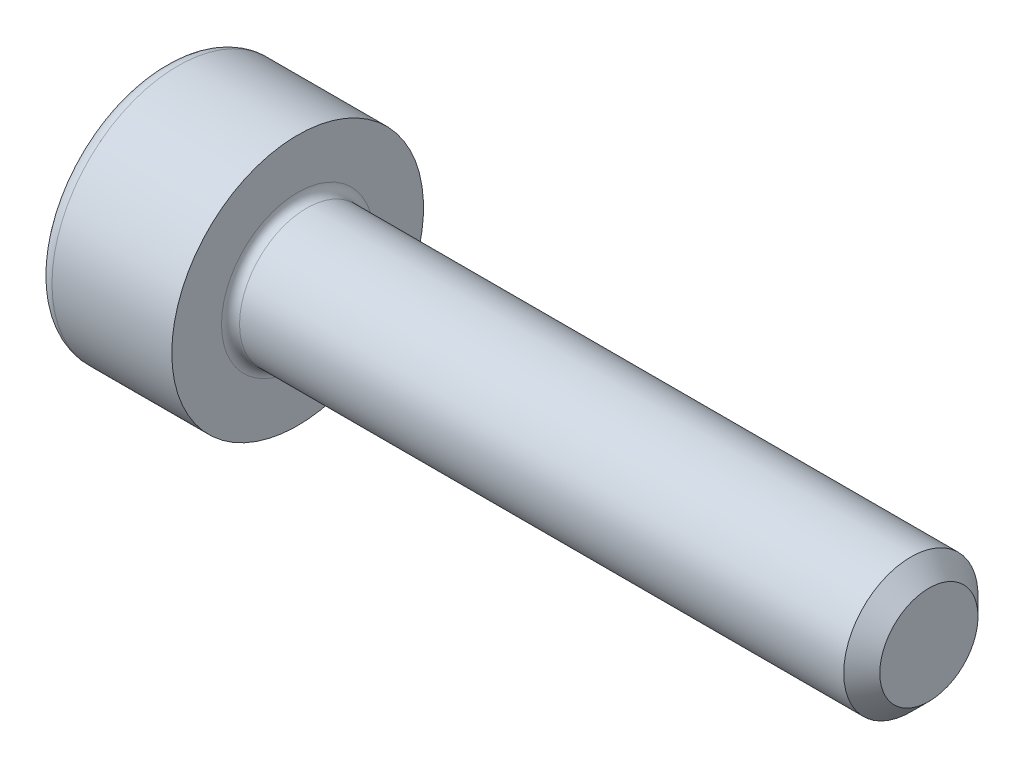
ISO-10303-21;
HEADER;
FILE_DESCRIPTION(('STEP AP214'),'2;1');
FILE_NAME('part.step','',(''),(''),'','','');
FILE_SCHEMA(('AUTOMOTIVE_DESIGN { 1 0 10303 214 1 1 1 1 }'));
ENDSEC;
DATA;
#1=APPLICATION_CONTEXT('core data for automotive mechanical design processes');
#2=APPLICATION_PROTOCOL_DEFINITION('international standard','automotive_design',2000,#1);
#3=PRODUCT_CONTEXT('',#1,'mechanical');
#4=PRODUCT('Part','Part','',(#3));
#5=PRODUCT_RELATED_PRODUCT_CATEGORY('part','',(#4));
#6=PRODUCT_DEFINITION_FORMATION('','',#4);
#7=PRODUCT_DEFINITION_CONTEXT('part definition',#1,'design');
#8=PRODUCT_DEFINITION('design','',#6,#7);
#9=PRODUCT_DEFINITION_SHAPE('','',#8);
#10=(LENGTH_UNIT() NAMED_UNIT(*) SI_UNIT(.MILLI.,.METRE.));
#11=(NAMED_UNIT(*) PLANE_ANGLE_UNIT() SI_UNIT($,.RADIAN.));
#12=(NAMED_UNIT(*) SI_UNIT($,.STERADIAN.) SOLID_ANGLE_UNIT());
#13=UNCERTAINTY_MEASURE_WITH_UNIT(LENGTH_MEASURE(1.E-05),#10,'distance_accuracy_value','');
#14=(GEOMETRIC_REPRESENTATION_CONTEXT(3) GLOBAL_UNCERTAINTY_ASSIGNED_CONTEXT((#13)) GLOBAL_UNIT_ASSIGNED_CONTEXT((#10,
#11,#12)) REPRESENTATION_CONTEXT('',''));
#15=CARTESIAN_POINT('',(0.,0.,0.));
#16=DIRECTION('',(0.,0.,1.));
#17=DIRECTION('',(1.,0.,0.));
#18=AXIS2_PLACEMENT_3D('',#15,#16,#17);
#19=CARTESIAN_POINT('',(0.,0.,0.));
#20=DIRECTION('',(-1.,0.,0.));
#21=DIRECTION('',(0.,0.,1.));
#22=AXIS2_PLACEMENT_3D('',#19,#20,#21);
#23=CYLINDRICAL_SURFACE('',#22,1.39568824458778);
#24=CARTESIAN_POINT('',(0.16,0.,0.));
#25=DIRECTION('',(1.,0.,0.));
#26=DIRECTION('',(0.,0.,-1.));
#27=AXIS2_PLACEMENT_3D('',#24,#25,#26);
#28=CIRCLE('',#27,1.39568824458778);
#29=CARTESIAN_POINT('',(0.16,0.,-1.39568824458778));
#30=VERTEX_POINT('',#29);
#31=EDGE_CURVE('E169',#30,#30,#28,.T.);
#32=ORIENTED_EDGE('',*,*,#31,.T.);
#33=EDGE_LOOP('',(#32));
#34=FACE_BOUND('',#33,.T.);
#35=CARTESIAN_POINT('',(1.48873412756029,0.,0.));
#36=DIRECTION('',(-1.,0.,0.));
#37=DIRECTION('',(0.,0.,1.));
#38=AXIS2_PLACEMENT_3D('',#35,#36,#37);
#39=CIRCLE('',#38,1.39568824458778);
#40=CARTESIAN_POINT('',(1.48873412756029,0.,1.39568824458778));
#41=VERTEX_POINT('',#40);
#42=EDGE_CURVE('E152',#41,#41,#39,.T.);
#43=ORIENTED_EDGE('',*,*,#42,.T.);
#44=EDGE_LOOP('',(#43));
#45=FACE_BOUND('',#44,.T.);
#46=ADVANCED_FACE('F50',(#34,#45),#23,.T.);
#47=CARTESIAN_POINT('',(0.,0.,0.));
#48=DIRECTION('',(1.,0.,0.));
#49=DIRECTION('',(0.,0.,-1.));
#50=AXIS2_PLACEMENT_3D('',#47,#48,#49);
#51=PLANE('',#50);
#52=DIRECTION('',(0.,-0.5,-0.866025403784439));
#53=VECTOR('',#52,1.);
#54=CARTESIAN_POINT('',(0.,0.877572409168232,0.));
#55=LINE('',#54,#53);
#56=CARTESIAN_POINT('',(0.,0.877572409168232,0.));
#57=VERTEX_POINT('',#56);
#58=CARTESIAN_POINT('',(0.,0.438786204584116,-0.760000000000001));
#59=VERTEX_POINT('',#58);
#60=EDGE_CURVE('E139',#57,#59,#55,.T.);
#61=ORIENTED_EDGE('',*,*,#60,.F.);
#62=DIRECTION('',(0.,0.5,-0.866025403784439));
#63=VECTOR('',#62,1.);
#64=CARTESIAN_POINT('',(0.,0.438786204584116,0.76));
#65=LINE('',#64,#63);
#66=CARTESIAN_POINT('',(0.,0.438786204584116,0.76));
#67=VERTEX_POINT('',#66);
#68=EDGE_CURVE('E65',#67,#57,#65,.T.);
#69=ORIENTED_EDGE('',*,*,#68,.F.);
#70=DIRECTION('',(0.,1.,0.));
#71=VECTOR('',#70,1.);
#72=CARTESIAN_POINT('',(0.,-0.438786204584116,0.76));
#73=LINE('',#72,#71);
#74=CARTESIAN_POINT('',(0.,-0.438786204584116,0.76));
#75=VERTEX_POINT('',#74);
#76=EDGE_CURVE('E148',#75,#67,#73,.T.);
#77=ORIENTED_EDGE('',*,*,#76,.F.);
#78=DIRECTION('',(0.,0.5,0.866025403784439));
#79=VECTOR('',#78,1.);
#80=CARTESIAN_POINT('',(0.,-0.877572409168232,0.));
#81=LINE('',#80,#79);
#82=CARTESIAN_POINT('',(0.,-0.877572409168232,0.));
#83=VERTEX_POINT('',#82);
#84=EDGE_CURVE('E146',#83,#75,#81,.T.);
#85=ORIENTED_EDGE('',*,*,#84,.F.);
#86=DIRECTION('',(0.,-0.5,0.866025403784438));
#87=VECTOR('',#86,1.);
#88=CARTESIAN_POINT('',(0.,-0.438786204584116,-0.760000000000001));
#89=LINE('',#88,#87);
#90=CARTESIAN_POINT('',(0.,-0.438786204584116,-0.760000000000001));
#91=VERTEX_POINT('',#90);
#92=EDGE_CURVE('E113',#91,#83,#89,.T.);
#93=ORIENTED_EDGE('',*,*,#92,.F.);
#94=DIRECTION('',(0.,-1.,0.));
#95=VECTOR('',#94,1.);
#96=CARTESIAN_POINT('',(0.,0.438786204584116,-0.760000000000001));
#97=LINE('',#96,#95);
#98=EDGE_CURVE('E142',#59,#91,#97,.T.);
#99=ORIENTED_EDGE('',*,*,#98,.F.);
#100=EDGE_LOOP('',(#61,#69,#77,#85,#93,#99));
#101=FACE_BOUND('',#100,.T.);
#102=CARTESIAN_POINT('',(0.,0.,0.));
#103=DIRECTION('',(1.,0.,0.));
#104=DIRECTION('',(0.,0.,-1.));
#105=AXIS2_PLACEMENT_3D('',#102,#103,#104);
#106=CIRCLE('',#105,1.23568824458778);
#107=CARTESIAN_POINT('',(0.,0.,-1.23568824458778));
#108=VERTEX_POINT('',#107);
#109=EDGE_CURVE('E166',#108,#108,#106,.F.);
#110=ORIENTED_EDGE('',*,*,#109,.T.);
#111=EDGE_LOOP('',(#110));
#112=FACE_BOUND('',#111,.T.);
#113=ADVANCED_FACE('F191',(#101,#112),#51,.F.);
#114=CARTESIAN_POINT('',(8.4887341275603,0.,0.));
#115=DIRECTION('',(-1.,0.,0.));
#116=DIRECTION('',(0.,0.,1.));
#117=AXIS2_PLACEMENT_3D('',#114,#115,#116);
#118=PLANE('',#117);
#119=CARTESIAN_POINT('',(8.4887341275603,0.,0.));
#120=DIRECTION('',(-1.,0.,0.));
#121=DIRECTION('',(0.,0.,1.));
#122=AXIS2_PLACEMENT_3D('',#119,#120,#121);
#123=CIRCLE('',#122,0.544367063780148);
#124=CARTESIAN_POINT('',(8.4887341275603,0.,0.544367063780148));
#125=VERTEX_POINT('',#124);
#126=EDGE_CURVE('E13',#125,#125,#123,.F.);
#127=ORIENTED_EDGE('',*,*,#126,.T.);
#128=EDGE_LOOP('',(#127));
#129=FACE_BOUND('',#128,.T.);
#130=ADVANCED_FACE('F197',(#129),#118,.F.);
#131=CARTESIAN_POINT('',(0.,0.,0.));
#132=DIRECTION('',(-1.,0.,0.));
#133=DIRECTION('',(0.,0.,1.));
#134=AXIS2_PLACEMENT_3D('',#131,#132,#133);
#135=CYLINDRICAL_SURFACE('',#134,0.744367063780147);
#136=CARTESIAN_POINT('',(8.2887341275603,0.,0.));
#137=DIRECTION('',(-1.,0.,0.));
#138=DIRECTION('',(0.,0.,1.));
#139=AXIS2_PLACEMENT_3D('',#136,#137,#138);
#140=CIRCLE('',#139,0.744367063780147);
#141=CARTESIAN_POINT('',(8.2887341275603,0.,0.744367063780147));
#142=VERTEX_POINT('',#141);
#143=EDGE_CURVE('E58',#142,#142,#140,.T.);
#144=ORIENTED_EDGE('',*,*,#143,.T.);
#145=EDGE_LOOP('',(#144));
#146=FACE_BOUND('',#145,.T.);
#147=CARTESIAN_POINT('',(1.58873412756029,0.,0.));
#148=DIRECTION('',(-1.,0.,0.));
#149=DIRECTION('',(0.,0.,1.));
#150=AXIS2_PLACEMENT_3D('',#147,#148,#149);
#151=CIRCLE('',#150,0.744367063780147);
#152=CARTESIAN_POINT('',(1.58873412756029,0.,0.744367063780147));
#153=VERTEX_POINT('',#152);
#154=EDGE_CURVE('E163',#153,#153,#151,.F.);
#155=ORIENTED_EDGE('',*,*,#154,.T.);
#156=EDGE_LOOP('',(#155));
#157=FACE_BOUND('',#156,.T.);
#158=ADVANCED_FACE('F174',(#146,#157),#135,.T.);
#159=CARTESIAN_POINT('',(1.48873412756029,0.,0.));
#160=DIRECTION('',(-1.,0.,0.));
#161=DIRECTION('',(0.,0.,1.));
#162=AXIS2_PLACEMENT_3D('',#159,#160,#161);
#163=PLANE('',#162);
#164=CARTESIAN_POINT('',(1.48873412756029,0.,0.));
#165=DIRECTION('',(-1.,0.,0.));
#166=DIRECTION('',(0.,0.,1.));
#167=AXIS2_PLACEMENT_3D('',#164,#165,#166);
#168=CIRCLE('',#167,0.844367063780147);
#169=CARTESIAN_POINT('',(1.48873412756029,0.,0.844367063780147));
#170=VERTEX_POINT('',#169);
#171=EDGE_CURVE('E160',#170,#170,#168,.T.);
#172=ORIENTED_EDGE('',*,*,#171,.T.);
#173=EDGE_LOOP('',(#172));
#174=FACE_BOUND('',#173,.T.);
#175=ORIENTED_EDGE('',*,*,#42,.F.);
#176=EDGE_LOOP('',(#175));
#177=FACE_BOUND('',#176,.T.);
#178=ADVANCED_FACE('F204',(#174,#177),#163,.F.);
#179=CARTESIAN_POINT('',(1.58873412756029,0.,0.));
#180=DIRECTION('',(-1.,0.,0.));
#181=DIRECTION('',(0.,0.,1.));
#182=AXIS2_PLACEMENT_3D('',#179,#180,#181);
#183=TOROIDAL_SURFACE('',#182,0.844367063780147,0.1);
#184=ORIENTED_EDGE('',*,*,#154,.F.);
#185=EDGE_LOOP('',(#184));
#186=FACE_BOUND('',#185,.T.);
#187=ORIENTED_EDGE('',*,*,#171,.F.);
#188=EDGE_LOOP('',(#187));
#189=FACE_BOUND('',#188,.T.);
#190=ADVANCED_FACE('F187',(#186,#189),#183,.F.);
#191=CARTESIAN_POINT('',(0.16,0.,0.));
#192=DIRECTION('',(1.,0.,0.));
#193=DIRECTION('',(0.,0.,-1.));
#194=AXIS2_PLACEMENT_3D('',#191,#192,#193);
#195=TOROIDAL_SURFACE('',#194,1.23568824458778,0.16);
#196=ORIENTED_EDGE('',*,*,#31,.F.);
#197=EDGE_LOOP('',(#196));
#198=FACE_BOUND('',#197,.T.);
#199=ORIENTED_EDGE('',*,*,#109,.F.);
#200=EDGE_LOOP('',(#199));
#201=FACE_BOUND('',#200,.T.);
#202=ADVANCED_FACE('F179',(#198,#201),#195,.T.);
#203=CARTESIAN_POINT('',(8.2887341275603,0.,0.));
#204=DIRECTION('',(-1.,0.,0.));
#205=DIRECTION('',(0.,0.,1.));
#206=AXIS2_PLACEMENT_3D('',#203,#204,#205);
#207=CONICAL_SURFACE('',#206,0.744367063780147,0.785398163397453);
#208=ORIENTED_EDGE('',*,*,#126,.F.);
#209=EDGE_LOOP('',(#208));
#210=FACE_BOUND('',#209,.T.);
#211=ORIENTED_EDGE('',*,*,#143,.F.);
#212=EDGE_LOOP('',(#211));
#213=FACE_BOUND('',#212,.T.);
#214=ADVANCED_FACE('F52',(#210,#213),#207,.T.);
#215=CARTESIAN_POINT('',(0.7,0.438786204584116,0.76));
#216=DIRECTION('',(0.,0.866025403784439,0.5));
#217=DIRECTION('',(0.,-0.5,0.866025403784439));
#218=AXIS2_PLACEMENT_3D('',#215,#216,#217);
#219=PLANE('',#218);
#220=ORIENTED_EDGE('',*,*,#68,.T.);
#221=DIRECTION('',(-1.,0.,0.));
#222=VECTOR('',#221,1.);
#223=CARTESIAN_POINT('',(0.7,0.877572409168232,0.));
#224=LINE('',#223,#222);
#225=CARTESIAN_POINT('',(0.7,0.877572409168232,0.));
#226=VERTEX_POINT('',#225);
#227=EDGE_CURVE('E95',#226,#57,#224,.T.);
#228=ORIENTED_EDGE('',*,*,#227,.F.);
#229=DIRECTION('',(0.,0.5,-0.866025403784439));
#230=VECTOR('',#229,1.);
#231=CARTESIAN_POINT('',(0.7,0.438786204584116,0.76));
#232=LINE('',#231,#230);
#233=CARTESIAN_POINT('',(0.7,0.438786204584116,0.76));
#234=VERTEX_POINT('',#233);
#235=EDGE_CURVE('E150',#234,#226,#232,.T.);
#236=ORIENTED_EDGE('',*,*,#235,.F.);
#237=DIRECTION('',(-1.,0.,0.));
#238=VECTOR('',#237,1.);
#239=CARTESIAN_POINT('',(0.7,0.438786204584116,0.76));
#240=LINE('',#239,#238);
#241=EDGE_CURVE('E73',#234,#67,#240,.T.);
#242=ORIENTED_EDGE('',*,*,#241,.T.);
#243=EDGE_LOOP('',(#220,#228,#236,#242));
#244=FACE_BOUND('',#243,.T.);
#245=ADVANCED_FACE('F178',(#244),#219,.F.);
#246=CARTESIAN_POINT('',(0.7,-0.438786204584116,0.76));
#247=DIRECTION('',(0.,0.,1.));
#248=DIRECTION('',(1.,0.,0.));
#249=AXIS2_PLACEMENT_3D('',#246,#247,#248);
#250=PLANE('',#249);
#251=ORIENTED_EDGE('',*,*,#76,.T.);
#252=ORIENTED_EDGE('',*,*,#241,.F.);
#253=DIRECTION('',(0.,1.,0.));
#254=VECTOR('',#253,1.);
#255=CARTESIAN_POINT('',(0.7,-0.438786204584116,0.76));
#256=LINE('',#255,#254);
#257=CARTESIAN_POINT('',(0.7,-0.438786204584116,0.76));
#258=VERTEX_POINT('',#257);
#259=EDGE_CURVE('E125',#258,#234,#256,.T.);
#260=ORIENTED_EDGE('',*,*,#259,.F.);
#261=DIRECTION('',(-1.,0.,0.));
#262=VECTOR('',#261,1.);
#263=CARTESIAN_POINT('',(0.7,-0.438786204584116,0.76));
#264=LINE('',#263,#262);
#265=EDGE_CURVE('E117',#258,#75,#264,.T.);
#266=ORIENTED_EDGE('',*,*,#265,.T.);
#267=EDGE_LOOP('',(#251,#252,#260,#266));
#268=FACE_BOUND('',#267,.T.);
#269=ADVANCED_FACE('F185',(#268),#250,.F.);
#270=CARTESIAN_POINT('',(0.7,-0.877572409168232,0.));
#271=DIRECTION('',(0.,-0.866025403784439,0.5));
#272=DIRECTION('',(0.,-0.5,-0.866025403784439));
#273=AXIS2_PLACEMENT_3D('',#270,#271,#272);
#274=PLANE('',#273);
#275=ORIENTED_EDGE('',*,*,#84,.T.);
#276=ORIENTED_EDGE('',*,*,#265,.F.);
#277=DIRECTION('',(0.,0.5,0.866025403784439));
#278=VECTOR('',#277,1.);
#279=CARTESIAN_POINT('',(0.7,-0.877572409168232,0.));
#280=LINE('',#279,#278);
#281=CARTESIAN_POINT('',(0.7,-0.877572409168232,0.));
#282=VERTEX_POINT('',#281);
#283=EDGE_CURVE('E121',#282,#258,#280,.T.);
#284=ORIENTED_EDGE('',*,*,#283,.F.);
#285=DIRECTION('',(-1.,0.,0.));
#286=VECTOR('',#285,1.);
#287=CARTESIAN_POINT('',(0.7,-0.877572409168232,0.));
#288=LINE('',#287,#286);
#289=EDGE_CURVE('E106',#282,#83,#288,.T.);
#290=ORIENTED_EDGE('',*,*,#289,.T.);
#291=EDGE_LOOP('',(#275,#276,#284,#290));
#292=FACE_BOUND('',#291,.T.);
#293=ADVANCED_FACE('F122',(#292),#274,.F.);
#294=CARTESIAN_POINT('',(0.7,-0.438786204584116,-0.760000000000001));
#295=DIRECTION('',(0.,-0.866025403784438,-0.5));
#296=DIRECTION('',(0.,0.5,-0.866025403784438));
#297=AXIS2_PLACEMENT_3D('',#294,#295,#296);
#298=PLANE('',#297);
#299=ORIENTED_EDGE('',*,*,#92,.T.);
#300=ORIENTED_EDGE('',*,*,#289,.F.);
#301=DIRECTION('',(0.,-0.5,0.866025403784438));
#302=VECTOR('',#301,1.);
#303=CARTESIAN_POINT('',(0.7,-0.438786204584116,-0.760000000000001));
#304=LINE('',#303,#302);
#305=CARTESIAN_POINT('',(0.7,-0.438786204584116,-0.760000000000001));
#306=VERTEX_POINT('',#305);
#307=EDGE_CURVE('E110',#306,#282,#304,.T.);
#308=ORIENTED_EDGE('',*,*,#307,.F.);
#309=DIRECTION('',(-1.,0.,0.));
#310=VECTOR('',#309,1.);
#311=CARTESIAN_POINT('',(0.7,-0.438786204584116,-0.760000000000001));
#312=LINE('',#311,#310);
#313=EDGE_CURVE('E118',#306,#91,#312,.T.);
#314=ORIENTED_EDGE('',*,*,#313,.T.);
#315=EDGE_LOOP('',(#299,#300,#308,#314));
#316=FACE_BOUND('',#315,.T.);
#317=ADVANCED_FACE('F108',(#316),#298,.F.);
#318=CARTESIAN_POINT('',(0.7,0.438786204584116,-0.760000000000001));
#319=DIRECTION('',(0.,0.,-1.));
#320=DIRECTION('',(0.,1.,0.));
#321=AXIS2_PLACEMENT_3D('',#318,#319,#320);
#322=PLANE('',#321);
#323=ORIENTED_EDGE('',*,*,#98,.T.);
#324=ORIENTED_EDGE('',*,*,#313,.F.);
#325=DIRECTION('',(0.,-1.,0.));
#326=VECTOR('',#325,1.);
#327=CARTESIAN_POINT('',(0.7,0.438786204584116,-0.760000000000001));
#328=LINE('',#327,#326);
#329=CARTESIAN_POINT('',(0.7,0.438786204584116,-0.760000000000001));
#330=VERTEX_POINT('',#329);
#331=EDGE_CURVE('E131',#330,#306,#328,.T.);
#332=ORIENTED_EDGE('',*,*,#331,.F.);
#333=DIRECTION('',(-1.,0.,0.));
#334=VECTOR('',#333,1.);
#335=CARTESIAN_POINT('',(0.7,0.438786204584116,-0.760000000000001));
#336=LINE('',#335,#334);
#337=EDGE_CURVE('E155',#330,#59,#336,.T.);
#338=ORIENTED_EDGE('',*,*,#337,.T.);
#339=EDGE_LOOP('',(#323,#324,#332,#338));
#340=FACE_BOUND('',#339,.T.);
#341=ADVANCED_FACE('F226',(#340),#322,.F.);
#342=CARTESIAN_POINT('',(0.7,0.877572409168232,0.));
#343=DIRECTION('',(0.,0.866025403784439,-0.5));
#344=DIRECTION('',(0.,0.5,0.866025403784439));
#345=AXIS2_PLACEMENT_3D('',#342,#343,#344);
#346=PLANE('',#345);
#347=ORIENTED_EDGE('',*,*,#60,.T.);
#348=ORIENTED_EDGE('',*,*,#337,.F.);
#349=DIRECTION('',(0.,-0.5,-0.866025403784439));
#350=VECTOR('',#349,1.);
#351=CARTESIAN_POINT('',(0.7,0.877572409168232,0.));
#352=LINE('',#351,#350);
#353=EDGE_CURVE('E133',#226,#330,#352,.T.);
#354=ORIENTED_EDGE('',*,*,#353,.F.);
#355=ORIENTED_EDGE('',*,*,#227,.T.);
#356=EDGE_LOOP('',(#347,#348,#354,#355));
#357=FACE_BOUND('',#356,.T.);
#358=ADVANCED_FACE('F223',(#357),#346,.F.);
#359=CARTESIAN_POINT('',(0.7,0.,0.));
#360=DIRECTION('',(-1.,0.,0.));
#361=DIRECTION('',(0.,0.,1.));
#362=AXIS2_PLACEMENT_3D('',#359,#360,#361);
#363=PLANE('',#362);
#364=ORIENTED_EDGE('',*,*,#235,.T.);
#365=ORIENTED_EDGE('',*,*,#353,.T.);
#366=ORIENTED_EDGE('',*,*,#331,.T.);
#367=ORIENTED_EDGE('',*,*,#307,.T.);
#368=ORIENTED_EDGE('',*,*,#283,.T.);
#369=ORIENTED_EDGE('',*,*,#259,.T.);
#370=EDGE_LOOP('',(#364,#365,#366,#367,#368,#369));
#371=FACE_BOUND('',#370,.T.);
#372=ADVANCED_FACE('F128',(#371),#363,.T.);
#373=CLOSED_SHELL('',(#46,#113,#130,#158,#178,#190,#202,#214,#245,#269,#293,#317,#341,#358,#372));
#374=MANIFOLD_SOLID_BREP('B2',#373);
#375=ADVANCED_BREP_SHAPE_REPRESENTATION('',(#18,#374),#14);
#376=SHAPE_DEFINITION_REPRESENTATION(#9,#375);
ENDSEC;
END-ISO-10303-21;
